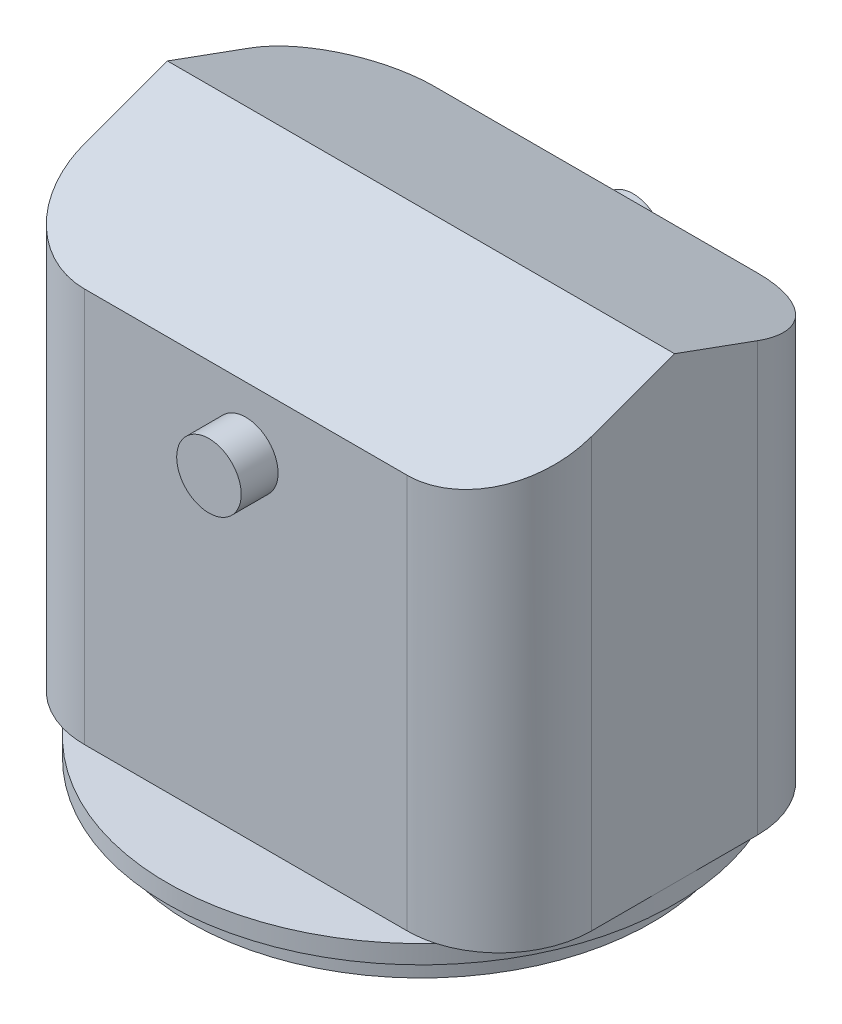
ISO-10303-21;
HEADER;
FILE_DESCRIPTION(('STEP AP214'),'2;1');
FILE_NAME('part.step','',(''),(''),'','','');
FILE_SCHEMA(('AUTOMOTIVE_DESIGN { 1 0 10303 214 1 1 1 1 }'));
ENDSEC;
DATA;
#1=APPLICATION_CONTEXT('core data for automotive mechanical design processes');
#2=APPLICATION_PROTOCOL_DEFINITION('international standard','automotive_design',2000,#1);
#3=PRODUCT_CONTEXT('',#1,'mechanical');
#4=PRODUCT('Part','Part','',(#3));
#5=PRODUCT_RELATED_PRODUCT_CATEGORY('part','',(#4));
#6=PRODUCT_DEFINITION_FORMATION('','',#4);
#7=PRODUCT_DEFINITION_CONTEXT('part definition',#1,'design');
#8=PRODUCT_DEFINITION('design','',#6,#7);
#9=PRODUCT_DEFINITION_SHAPE('','',#8);
#10=(LENGTH_UNIT() NAMED_UNIT(*) SI_UNIT(.MILLI.,.METRE.));
#11=(NAMED_UNIT(*) PLANE_ANGLE_UNIT() SI_UNIT($,.RADIAN.));
#12=(NAMED_UNIT(*) SI_UNIT($,.STERADIAN.) SOLID_ANGLE_UNIT());
#13=UNCERTAINTY_MEASURE_WITH_UNIT(LENGTH_MEASURE(1.E-05),#10,'distance_accuracy_value','');
#14=(GEOMETRIC_REPRESENTATION_CONTEXT(3) GLOBAL_UNCERTAINTY_ASSIGNED_CONTEXT((#13)) GLOBAL_UNIT_ASSIGNED_CONTEXT((#10,
#11,#12)) REPRESENTATION_CONTEXT('',''));
#15=CARTESIAN_POINT('',(0.,0.,0.));
#16=DIRECTION('',(0.,0.,1.));
#17=DIRECTION('',(1.,0.,0.));
#18=AXIS2_PLACEMENT_3D('',#15,#16,#17);
#19=CARTESIAN_POINT('',(0.,2.,0.));
#20=DIRECTION('',(0.,1.,0.));
#21=DIRECTION('',(0.,0.,1.));
#22=AXIS2_PLACEMENT_3D('',#19,#20,#21);
#23=PLANE('',#22);
#24=CARTESIAN_POINT('',(-17.5,2.,-9.));
#25=DIRECTION('',(0.,1.,0.));
#26=DIRECTION('',(0.,0.,-1.));
#27=AXIS2_PLACEMENT_3D('',#24,#25,#26);
#28=CIRCLE('',#27,10.);
#29=CARTESIAN_POINT('',(-17.4999999999999,2.,-19.));
#30=VERTEX_POINT('',#29);
#31=CARTESIAN_POINT('',(-20.2396202307024,2.,-18.6174051069676));
#32=VERTEX_POINT('',#31);
#33=EDGE_CURVE('E175',#30,#32,#28,.T.);
#34=ORIENTED_EDGE('',*,*,#33,.F.);
#35=DIRECTION('',(-1.,0.,0.));
#36=VECTOR('',#35,1.);
#37=CARTESIAN_POINT('',(-17.4999999999999,2.,-19.));
#38=LINE('',#37,#36);
#39=CARTESIAN_POINT('',(17.4999999999999,2.,-19.));
#40=VERTEX_POINT('',#39);
#41=EDGE_CURVE('E170',#40,#30,#38,.T.);
#42=ORIENTED_EDGE('',*,*,#41,.F.);
#43=CARTESIAN_POINT('',(17.5,2.,-9.));
#44=DIRECTION('',(0.,1.,0.));
#45=DIRECTION('',(0.,0.,-1.));
#46=AXIS2_PLACEMENT_3D('',#43,#44,#45);
#47=CIRCLE('',#46,10.);
#48=CARTESIAN_POINT('',(20.2396202307024,2.,-18.6174051069676));
#49=VERTEX_POINT('',#48);
#50=EDGE_CURVE('E171',#49,#40,#47,.T.);
#51=ORIENTED_EDGE('',*,*,#50,.F.);
#52=CARTESIAN_POINT('',(0.,2.,0.));
#53=DIRECTION('',(0.,1.,0.));
#54=DIRECTION('',(0.,0.,1.));
#55=AXIS2_PLACEMENT_3D('',#52,#53,#54);
#56=CIRCLE('',#55,27.5);
#57=EDGE_CURVE('E521',#49,#32,#56,.T.);
#58=ORIENTED_EDGE('',*,*,#57,.T.);
#59=EDGE_LOOP('',(#34,#42,#51,#58));
#60=FACE_BOUND('',#59,.T.);
#61=ADVANCED_FACE('F41',(#60),#23,.T.);
#62=CARTESIAN_POINT('',(0.,2.,0.));
#63=DIRECTION('',(0.,-1.,0.));
#64=DIRECTION('',(0.,0.,-1.));
#65=AXIS2_PLACEMENT_3D('',#62,#63,#64);
#66=CYLINDRICAL_SURFACE('',#65,27.5);
#67=CARTESIAN_POINT('',(20.2396202307024,2.,18.6174051069676));
#68=VERTEX_POINT('',#67);
#69=CARTESIAN_POINT('',(27.5,2.,0.));
#70=VERTEX_POINT('',#69);
#71=EDGE_CURVE('E204',#68,#70,#56,.T.);
#72=ORIENTED_EDGE('',*,*,#71,.F.);
#73=CARTESIAN_POINT('',(-20.2396202307024,2.,18.6174051069676));
#74=VERTEX_POINT('',#73);
#75=EDGE_CURVE('E150',#74,#68,#56,.T.);
#76=ORIENTED_EDGE('',*,*,#75,.F.);
#77=CARTESIAN_POINT('',(-27.5,2.,0.));
#78=VERTEX_POINT('',#77);
#79=EDGE_CURVE('E515',#78,#74,#56,.T.);
#80=ORIENTED_EDGE('',*,*,#79,.F.);
#81=EDGE_CURVE('E520',#32,#78,#56,.T.);
#82=ORIENTED_EDGE('',*,*,#81,.F.);
#83=ORIENTED_EDGE('',*,*,#57,.F.);
#84=EDGE_CURVE('E208',#70,#49,#56,.T.);
#85=ORIENTED_EDGE('',*,*,#84,.F.);
#86=EDGE_LOOP('',(#72,#76,#80,#82,#83,#85));
#87=FACE_BOUND('',#86,.T.);
#88=CARTESIAN_POINT('',(0.,0.,0.));
#89=DIRECTION('',(0.,1.,0.));
#90=DIRECTION('',(0.,0.,1.));
#91=AXIS2_PLACEMENT_3D('',#88,#89,#90);
#92=CIRCLE('',#91,27.5);
#93=CARTESIAN_POINT('',(0.,0.,27.5));
#94=VERTEX_POINT('',#93);
#95=EDGE_CURVE('E203',#94,#94,#92,.T.);
#96=ORIENTED_EDGE('',*,*,#95,.T.);
#97=EDGE_LOOP('',(#96));
#98=FACE_BOUND('',#97,.T.);
#99=ADVANCED_FACE('F250',(#87,#98),#66,.T.);
#100=CARTESIAN_POINT('',(-17.5,2.,9.));
#101=DIRECTION('',(0.,1.,0.));
#102=DIRECTION('',(0.,0.,-1.));
#103=AXIS2_PLACEMENT_3D('',#100,#101,#102);
#104=CIRCLE('',#103,10.);
#105=CARTESIAN_POINT('',(-17.4999999999999,2.,19.));
#106=VERTEX_POINT('',#105);
#107=EDGE_CURVE('E161',#74,#106,#104,.T.);
#108=ORIENTED_EDGE('',*,*,#107,.F.);
#109=ORIENTED_EDGE('',*,*,#75,.T.);
#110=CARTESIAN_POINT('',(17.5,2.,9.));
#111=DIRECTION('',(0.,1.,0.));
#112=DIRECTION('',(0.,0.,1.));
#113=AXIS2_PLACEMENT_3D('',#110,#111,#112);
#114=CIRCLE('',#113,10.);
#115=CARTESIAN_POINT('',(17.4999999999999,2.,19.));
#116=VERTEX_POINT('',#115);
#117=EDGE_CURVE('E136',#116,#68,#114,.T.);
#118=ORIENTED_EDGE('',*,*,#117,.F.);
#119=DIRECTION('',(1.,0.,0.));
#120=VECTOR('',#119,1.);
#121=CARTESIAN_POINT('',(-17.4999999999999,2.,19.));
#122=LINE('',#121,#120);
#123=EDGE_CURVE('E147',#106,#116,#122,.T.);
#124=ORIENTED_EDGE('',*,*,#123,.F.);
#125=EDGE_LOOP('',(#108,#109,#118,#124));
#126=FACE_BOUND('',#125,.T.);
#127=ADVANCED_FACE('F146',(#126),#23,.T.);
#128=CARTESIAN_POINT('',(0.,0.,0.));
#129=DIRECTION('',(0.,1.,0.));
#130=DIRECTION('',(0.,0.,1.));
#131=AXIS2_PLACEMENT_3D('',#128,#129,#130);
#132=PLANE('',#131);
#133=CARTESIAN_POINT('',(0.,0.,0.));
#134=DIRECTION('',(0.,1.,0.));
#135=DIRECTION('',(0.,0.,1.));
#136=AXIS2_PLACEMENT_3D('',#133,#134,#135);
#137=CIRCLE('',#136,25.);
#138=CARTESIAN_POINT('',(0.,0.,25.));
#139=VERTEX_POINT('',#138);
#140=EDGE_CURVE('E207',#139,#139,#137,.F.);
#141=ORIENTED_EDGE('',*,*,#140,.F.);
#142=EDGE_LOOP('',(#141));
#143=FACE_BOUND('',#142,.T.);
#144=ORIENTED_EDGE('',*,*,#95,.F.);
#145=EDGE_LOOP('',(#144));
#146=FACE_BOUND('',#145,.T.);
#147=ADVANCED_FACE('F262',(#143,#146),#132,.F.);
#148=CARTESIAN_POINT('',(0.,-3.,0.));
#149=DIRECTION('',(0.,-1.,0.));
#150=DIRECTION('',(0.,0.,-1.));
#151=AXIS2_PLACEMENT_3D('',#148,#149,#150);
#152=PLANE('',#151);
#153=CARTESIAN_POINT('',(0.,-3.,0.));
#154=DIRECTION('',(0.,-1.,0.));
#155=DIRECTION('',(0.,0.,-1.));
#156=AXIS2_PLACEMENT_3D('',#153,#154,#155);
#157=CIRCLE('',#156,25.);
#158=CARTESIAN_POINT('',(0.,-3.,-25.));
#159=VERTEX_POINT('',#158);
#160=EDGE_CURVE('E198',#159,#159,#157,.T.);
#161=ORIENTED_EDGE('',*,*,#160,.T.);
#162=EDGE_LOOP('',(#161));
#163=FACE_BOUND('',#162,.T.);
#164=CARTESIAN_POINT('',(0.,-3.,0.));
#165=DIRECTION('',(0.,-1.,0.));
#166=DIRECTION('',(0.,0.,-1.));
#167=AXIS2_PLACEMENT_3D('',#164,#165,#166);
#168=CIRCLE('',#167,23.);
#169=CARTESIAN_POINT('',(0.,-3.,-23.));
#170=VERTEX_POINT('',#169);
#171=EDGE_CURVE('E195',#170,#170,#168,.T.);
#172=ORIENTED_EDGE('',*,*,#171,.F.);
#173=EDGE_LOOP('',(#172));
#174=FACE_BOUND('',#173,.T.);
#175=ADVANCED_FACE('F266',(#163,#174),#152,.T.);
#176=CARTESIAN_POINT('',(0.,-3.,0.));
#177=DIRECTION('',(0.,1.,0.));
#178=DIRECTION('',(0.,0.,1.));
#179=AXIS2_PLACEMENT_3D('',#176,#177,#178);
#180=CYLINDRICAL_SURFACE('',#179,25.);
#181=ORIENTED_EDGE('',*,*,#160,.F.);
#182=EDGE_LOOP('',(#181));
#183=FACE_BOUND('',#182,.T.);
#184=ORIENTED_EDGE('',*,*,#140,.T.);
#185=EDGE_LOOP('',(#184));
#186=FACE_BOUND('',#185,.T.);
#187=ADVANCED_FACE('F272',(#183,#186),#180,.T.);
#188=CARTESIAN_POINT('',(0.,-3.,0.));
#189=DIRECTION('',(0.,1.,0.));
#190=DIRECTION('',(0.,0.,1.));
#191=AXIS2_PLACEMENT_3D('',#188,#189,#190);
#192=CYLINDRICAL_SURFACE('',#191,23.);
#193=ORIENTED_EDGE('',*,*,#171,.T.);
#194=EDGE_LOOP('',(#193));
#195=FACE_BOUND('',#194,.T.);
#196=CARTESIAN_POINT('',(0.,0.,0.));
#197=DIRECTION('',(0.,-1.,0.));
#198=DIRECTION('',(0.,0.,-1.));
#199=AXIS2_PLACEMENT_3D('',#196,#197,#198);
#200=CIRCLE('',#199,23.);
#201=CARTESIAN_POINT('',(0.,0.,-23.));
#202=VERTEX_POINT('',#201);
#203=EDGE_CURVE('E194',#202,#202,#200,.T.);
#204=ORIENTED_EDGE('',*,*,#203,.F.);
#205=EDGE_LOOP('',(#204));
#206=FACE_BOUND('',#205,.T.);
#207=ADVANCED_FACE('F279',(#195,#206),#192,.F.);
#208=ORIENTED_EDGE('',*,*,#203,.T.);
#209=EDGE_LOOP('',(#208));
#210=FACE_BOUND('',#209,.T.);
#211=ADVANCED_FACE('F268',(#210),#132,.F.);
#212=CARTESIAN_POINT('',(-17.5,2.,9.));
#213=DIRECTION('',(0.,-1.,0.));
#214=DIRECTION('',(0.,0.,-1.));
#215=AXIS2_PLACEMENT_3D('',#212,#213,#214);
#216=PLANE('',#215);
#217=CARTESIAN_POINT('',(27.5,2.,8.99999999999993));
#218=VERTEX_POINT('',#217);
#219=EDGE_CURVE('E153',#68,#218,#114,.T.);
#220=ORIENTED_EDGE('',*,*,#219,.F.);
#221=ORIENTED_EDGE('',*,*,#71,.T.);
#222=DIRECTION('',(0.,0.,-1.));
#223=VECTOR('',#222,1.);
#224=CARTESIAN_POINT('',(27.5,2.,8.99999999999993));
#225=LINE('',#224,#223);
#226=EDGE_CURVE('E164',#218,#70,#225,.T.);
#227=ORIENTED_EDGE('',*,*,#226,.F.);
#228=EDGE_LOOP('',(#220,#221,#227));
#229=FACE_BOUND('',#228,.T.);
#230=ADVANCED_FACE('F278',(#229),#216,.T.);
#231=CARTESIAN_POINT('',(27.5,2.,-8.99999999999993));
#232=VERTEX_POINT('',#231);
#233=EDGE_CURVE('E152',#70,#232,#225,.T.);
#234=ORIENTED_EDGE('',*,*,#233,.F.);
#235=ORIENTED_EDGE('',*,*,#84,.T.);
#236=EDGE_CURVE('E167',#232,#49,#47,.T.);
#237=ORIENTED_EDGE('',*,*,#236,.F.);
#238=EDGE_LOOP('',(#234,#235,#237));
#239=FACE_BOUND('',#238,.T.);
#240=ADVANCED_FACE('F285',(#239),#216,.T.);
#241=CARTESIAN_POINT('',(-27.5,2.,-8.99999999999993));
#242=VERTEX_POINT('',#241);
#243=EDGE_CURVE('E174',#32,#242,#28,.T.);
#244=ORIENTED_EDGE('',*,*,#243,.F.);
#245=ORIENTED_EDGE('',*,*,#81,.T.);
#246=DIRECTION('',(0.,0.,1.));
#247=VECTOR('',#246,1.);
#248=CARTESIAN_POINT('',(-27.5,2.,8.99999999999993));
#249=LINE('',#248,#247);
#250=EDGE_CURVE('E179',#242,#78,#249,.T.);
#251=ORIENTED_EDGE('',*,*,#250,.F.);
#252=EDGE_LOOP('',(#244,#245,#251));
#253=FACE_BOUND('',#252,.T.);
#254=ADVANCED_FACE('F247',(#253),#216,.T.);
#255=CARTESIAN_POINT('',(-17.5,52.8,9.));
#256=DIRECTION('',(0.,-1.,0.));
#257=DIRECTION('',(0.,0.,-1.));
#258=AXIS2_PLACEMENT_3D('',#255,#256,#257);
#259=CYLINDRICAL_SURFACE('',#258,10.);
#260=DIRECTION('',(0.,-1.,0.));
#261=VECTOR('',#260,1.);
#262=CARTESIAN_POINT('',(-17.4999999999999,52.8,19.));
#263=LINE('',#262,#261);
#264=CARTESIAN_POINT('',(-17.4999999999999,44.7999999999998,19.));
#265=VERTEX_POINT('',#264);
#266=EDGE_CURVE('E141',#265,#106,#263,.T.);
#267=ORIENTED_EDGE('',*,*,#266,.F.);
#268=CARTESIAN_POINT('',(-17.5,48.4397023426618,9.));
#269=DIRECTION('',(0.,-0.93969262078591,-0.342020143325665));
#270=DIRECTION('',(0.,-0.342020143325665,0.93969262078591));
#271=AXIS2_PLACEMENT_3D('',#268,#269,#270);
#272=ELLIPSE('',#271,10.6417777247591,10.);
#273=CARTESIAN_POINT('',(-27.5,48.4397023426619,8.99999999999993));
#274=VERTEX_POINT('',#273);
#275=EDGE_CURVE('E57',#265,#274,#272,.T.);
#276=ORIENTED_EDGE('',*,*,#275,.T.);
#277=DIRECTION('',(0.,-1.,0.));
#278=VECTOR('',#277,1.);
#279=CARTESIAN_POINT('',(-27.5,52.8,8.99999999999993));
#280=LINE('',#279,#278);
#281=CARTESIAN_POINT('',(-27.5,2.,8.99999999999993));
#282=VERTEX_POINT('',#281);
#283=EDGE_CURVE('E182',#274,#282,#280,.T.);
#284=ORIENTED_EDGE('',*,*,#283,.T.);
#285=EDGE_CURVE('E156',#282,#74,#104,.T.);
#286=ORIENTED_EDGE('',*,*,#285,.T.);
#287=ORIENTED_EDGE('',*,*,#107,.T.);
#288=EDGE_LOOP('',(#267,#276,#284,#286,#287));
#289=FACE_BOUND('',#288,.T.);
#290=ADVANCED_FACE('F239',(#289),#259,.T.);
#291=CARTESIAN_POINT('',(-17.4999999999999,52.8,19.));
#292=DIRECTION('',(0.,0.,-1.));
#293=DIRECTION('',(-1.,0.,0.));
#294=AXIS2_PLACEMENT_3D('',#291,#292,#293);
#295=PLANE('',#294);
#296=CARTESIAN_POINT('',(0.,38.,19.));
#297=DIRECTION('',(0.,0.,-1.));
#298=DIRECTION('',(-1.,0.,0.));
#299=AXIS2_PLACEMENT_3D('',#296,#297,#298);
#300=CIRCLE('',#299,3.5);
#301=CARTESIAN_POINT('',(-3.5,38.,19.));
#302=VERTEX_POINT('',#301);
#303=EDGE_CURVE('E50',#302,#302,#300,.F.);
#304=ORIENTED_EDGE('',*,*,#303,.F.);
#305=EDGE_LOOP('',(#304));
#306=FACE_BOUND('',#305,.T.);
#307=DIRECTION('',(0.,-1.,0.));
#308=VECTOR('',#307,1.);
#309=CARTESIAN_POINT('',(17.4999999999999,52.8,19.));
#310=LINE('',#309,#308);
#311=CARTESIAN_POINT('',(17.4999999999999,44.7999999999998,19.));
#312=VERTEX_POINT('',#311);
#313=EDGE_CURVE('E131',#312,#116,#310,.T.);
#314=ORIENTED_EDGE('',*,*,#313,.F.);
#315=DIRECTION('',(-1.,0.,0.));
#316=VECTOR('',#315,1.);
#317=CARTESIAN_POINT('',(-17.4999999999999,44.7999999999998,19.));
#318=LINE('',#317,#316);
#319=EDGE_CURVE('E229',#312,#265,#318,.T.);
#320=ORIENTED_EDGE('',*,*,#319,.T.);
#321=ORIENTED_EDGE('',*,*,#266,.T.);
#322=ORIENTED_EDGE('',*,*,#123,.T.);
#323=EDGE_LOOP('',(#314,#320,#321,#322));
#324=FACE_BOUND('',#323,.T.);
#325=ADVANCED_FACE('F155',(#306,#324),#295,.F.);
#326=CARTESIAN_POINT('',(17.5,52.8,9.));
#327=DIRECTION('',(0.,-1.,0.));
#328=DIRECTION('',(0.,0.,-1.));
#329=AXIS2_PLACEMENT_3D('',#326,#327,#328);
#330=CYLINDRICAL_SURFACE('',#329,10.);
#331=DIRECTION('',(0.,-1.,0.));
#332=VECTOR('',#331,1.);
#333=CARTESIAN_POINT('',(27.5,52.8,8.99999999999993));
#334=LINE('',#333,#332);
#335=CARTESIAN_POINT('',(27.5,48.4397023426619,8.99999999999993));
#336=VERTEX_POINT('',#335);
#337=EDGE_CURVE('E142',#336,#218,#334,.T.);
#338=ORIENTED_EDGE('',*,*,#337,.F.);
#339=CARTESIAN_POINT('',(17.5,48.4397023426618,9.));
#340=DIRECTION('',(0.,-0.93969262078591,-0.342020143325665));
#341=DIRECTION('',(0.,-0.342020143325665,0.93969262078591));
#342=AXIS2_PLACEMENT_3D('',#339,#340,#341);
#343=ELLIPSE('',#342,10.6417777247591,10.);
#344=EDGE_CURVE('E138',#336,#312,#343,.T.);
#345=ORIENTED_EDGE('',*,*,#344,.T.);
#346=ORIENTED_EDGE('',*,*,#313,.T.);
#347=ORIENTED_EDGE('',*,*,#117,.T.);
#348=ORIENTED_EDGE('',*,*,#219,.T.);
#349=EDGE_LOOP('',(#338,#345,#346,#347,#348));
#350=FACE_BOUND('',#349,.T.);
#351=ADVANCED_FACE('F134',(#350),#330,.T.);
#352=CARTESIAN_POINT('',(27.5,52.8,8.99999999999993));
#353=DIRECTION('',(-1.,0.,0.));
#354=DIRECTION('',(0.,0.,1.));
#355=AXIS2_PLACEMENT_3D('',#352,#353,#354);
#356=PLANE('',#355);
#357=DIRECTION('',(0.,-0.342020143325669,-0.939692620785908));
#358=VECTOR('',#357,1.);
#359=CARTESIAN_POINT('',(27.5,52.8,2.97981935563695));
#360=LINE('',#359,#358);
#361=CARTESIAN_POINT('',(27.5,48.4397023426621,-8.99999999999993));
#362=VERTEX_POINT('',#361);
#363=CARTESIAN_POINT('',(27.5,51.7154344510577,-3.38704758684472E-13));
#364=VERTEX_POINT('',#363);
#365=EDGE_CURVE('E221',#362,#364,#360,.F.);
#366=ORIENTED_EDGE('',*,*,#365,.T.);
#367=DIRECTION('',(0.,0.342020143325665,-0.93969262078591));
#368=VECTOR('',#367,1.);
#369=CARTESIAN_POINT('',(27.5,52.8,-2.97981935563767));
#370=LINE('',#369,#368);
#371=EDGE_CURVE('E226',#364,#336,#370,.F.);
#372=ORIENTED_EDGE('',*,*,#371,.T.);
#373=ORIENTED_EDGE('',*,*,#337,.T.);
#374=ORIENTED_EDGE('',*,*,#226,.T.);
#375=ORIENTED_EDGE('',*,*,#233,.T.);
#376=DIRECTION('',(0.,-1.,0.));
#377=VECTOR('',#376,1.);
#378=CARTESIAN_POINT('',(27.5,52.8,-8.99999999999993));
#379=LINE('',#378,#377);
#380=EDGE_CURVE('E190',#362,#232,#379,.T.);
#381=ORIENTED_EDGE('',*,*,#380,.F.);
#382=EDGE_LOOP('',(#366,#372,#373,#374,#375,#381));
#383=FACE_BOUND('',#382,.T.);
#384=ADVANCED_FACE('F245',(#383),#356,.F.);
#385=CARTESIAN_POINT('',(17.5,52.8,-9.));
#386=DIRECTION('',(0.,-1.,0.));
#387=DIRECTION('',(0.,0.,-1.));
#388=AXIS2_PLACEMENT_3D('',#385,#386,#387);
#389=CYLINDRICAL_SURFACE('',#388,10.);
#390=DIRECTION('',(0.,-1.,0.));
#391=VECTOR('',#390,1.);
#392=CARTESIAN_POINT('',(17.4999999999999,52.8,-19.));
#393=LINE('',#392,#391);
#394=CARTESIAN_POINT('',(17.4999999999999,44.8,-19.));
#395=VERTEX_POINT('',#394);
#396=EDGE_CURVE('E188',#395,#40,#393,.T.);
#397=ORIENTED_EDGE('',*,*,#396,.F.);
#398=CARTESIAN_POINT('',(17.5,48.439702342662,-9.));
#399=DIRECTION('',(0.,-0.939692620785908,0.342020143325669));
#400=DIRECTION('',(0.,-0.342020143325669,-0.939692620785908));
#401=AXIS2_PLACEMENT_3D('',#398,#399,#400);
#402=ELLIPSE('',#401,10.6417777247591,10.);
#403=EDGE_CURVE('E219',#395,#362,#402,.T.);
#404=ORIENTED_EDGE('',*,*,#403,.T.);
#405=ORIENTED_EDGE('',*,*,#380,.T.);
#406=ORIENTED_EDGE('',*,*,#236,.T.);
#407=ORIENTED_EDGE('',*,*,#50,.T.);
#408=EDGE_LOOP('',(#397,#404,#405,#406,#407));
#409=FACE_BOUND('',#408,.T.);
#410=ADVANCED_FACE('F373',(#409),#389,.T.);
#411=CARTESIAN_POINT('',(-17.4999999999999,52.8,-19.));
#412=DIRECTION('',(0.,0.,1.));
#413=DIRECTION('',(1.,0.,0.));
#414=AXIS2_PLACEMENT_3D('',#411,#412,#413);
#415=PLANE('',#414);
#416=CARTESIAN_POINT('',(0.,38.,-19.));
#417=DIRECTION('',(0.,0.,1.));
#418=DIRECTION('',(1.,0.,0.));
#419=AXIS2_PLACEMENT_3D('',#416,#417,#418);
#420=CIRCLE('',#419,3.5);
#421=CARTESIAN_POINT('',(3.5,38.,-19.));
#422=VERTEX_POINT('',#421);
#423=EDGE_CURVE('E11',#422,#422,#420,.F.);
#424=ORIENTED_EDGE('',*,*,#423,.F.);
#425=EDGE_LOOP('',(#424));
#426=FACE_BOUND('',#425,.T.);
#427=DIRECTION('',(0.,-1.,0.));
#428=VECTOR('',#427,1.);
#429=CARTESIAN_POINT('',(-17.4999999999999,52.8,-19.));
#430=LINE('',#429,#428);
#431=CARTESIAN_POINT('',(-17.4999999999999,44.8,-19.));
#432=VERTEX_POINT('',#431);
#433=EDGE_CURVE('E186',#432,#30,#430,.T.);
#434=ORIENTED_EDGE('',*,*,#433,.F.);
#435=DIRECTION('',(1.,0.,0.));
#436=VECTOR('',#435,1.);
#437=CARTESIAN_POINT('',(-17.4999999999999,44.8,-19.));
#438=LINE('',#437,#436);
#439=EDGE_CURVE('E217',#432,#395,#438,.T.);
#440=ORIENTED_EDGE('',*,*,#439,.T.);
#441=ORIENTED_EDGE('',*,*,#396,.T.);
#442=ORIENTED_EDGE('',*,*,#41,.T.);
#443=EDGE_LOOP('',(#434,#440,#441,#442));
#444=FACE_BOUND('',#443,.T.);
#445=ADVANCED_FACE('F378',(#426,#444),#415,.F.);
#446=CARTESIAN_POINT('',(-17.5,52.8,-9.));
#447=DIRECTION('',(0.,-1.,0.));
#448=DIRECTION('',(0.,0.,-1.));
#449=AXIS2_PLACEMENT_3D('',#446,#447,#448);
#450=CYLINDRICAL_SURFACE('',#449,10.);
#451=DIRECTION('',(0.,-1.,0.));
#452=VECTOR('',#451,1.);
#453=CARTESIAN_POINT('',(-27.5,52.8,-8.99999999999993));
#454=LINE('',#453,#452);
#455=CARTESIAN_POINT('',(-27.5,48.4397023426621,-8.99999999999993));
#456=VERTEX_POINT('',#455);
#457=EDGE_CURVE('E184',#456,#242,#454,.T.);
#458=ORIENTED_EDGE('',*,*,#457,.F.);
#459=CARTESIAN_POINT('',(-17.5,48.439702342662,-9.));
#460=DIRECTION('',(0.,-0.939692620785908,0.342020143325669));
#461=DIRECTION('',(0.,-0.342020143325669,-0.939692620785908));
#462=AXIS2_PLACEMENT_3D('',#459,#460,#461);
#463=ELLIPSE('',#462,10.6417777247591,10.);
#464=EDGE_CURVE('E215',#456,#432,#463,.T.);
#465=ORIENTED_EDGE('',*,*,#464,.T.);
#466=ORIENTED_EDGE('',*,*,#433,.T.);
#467=ORIENTED_EDGE('',*,*,#33,.T.);
#468=ORIENTED_EDGE('',*,*,#243,.T.);
#469=EDGE_LOOP('',(#458,#465,#466,#467,#468));
#470=FACE_BOUND('',#469,.T.);
#471=ADVANCED_FACE('F388',(#470),#450,.T.);
#472=CARTESIAN_POINT('',(-27.5,52.8,8.99999999999993));
#473=DIRECTION('',(1.,0.,0.));
#474=DIRECTION('',(0.,0.,-1.));
#475=AXIS2_PLACEMENT_3D('',#472,#473,#474);
#476=PLANE('',#475);
#477=ORIENTED_EDGE('',*,*,#283,.F.);
#478=DIRECTION('',(0.,-0.342020143325665,0.93969262078591));
#479=VECTOR('',#478,1.);
#480=CARTESIAN_POINT('',(-27.5,52.8,-2.97981935563767));
#481=LINE('',#480,#479);
#482=CARTESIAN_POINT('',(-27.5,51.7154344510577,-3.38704758684472E-13));
#483=VERTEX_POINT('',#482);
#484=EDGE_CURVE('E232',#274,#483,#481,.F.);
#485=ORIENTED_EDGE('',*,*,#484,.T.);
#486=DIRECTION('',(0.,0.342020143325669,0.939692620785908));
#487=VECTOR('',#486,1.);
#488=CARTESIAN_POINT('',(-27.5,52.8,2.97981935563695));
#489=LINE('',#488,#487);
#490=EDGE_CURVE('E213',#483,#456,#489,.F.);
#491=ORIENTED_EDGE('',*,*,#490,.T.);
#492=ORIENTED_EDGE('',*,*,#457,.T.);
#493=ORIENTED_EDGE('',*,*,#250,.T.);
#494=EDGE_CURVE('E178',#78,#282,#249,.T.);
#495=ORIENTED_EDGE('',*,*,#494,.T.);
#496=EDGE_LOOP('',(#477,#485,#491,#492,#493,#495));
#497=FACE_BOUND('',#496,.T.);
#498=ADVANCED_FACE('F364',(#497),#476,.F.);
#499=ORIENTED_EDGE('',*,*,#494,.F.);
#500=ORIENTED_EDGE('',*,*,#79,.T.);
#501=ORIENTED_EDGE('',*,*,#285,.F.);
#502=EDGE_LOOP('',(#499,#500,#501));
#503=FACE_BOUND('',#502,.T.);
#504=ADVANCED_FACE('F288',(#503),#216,.T.);
#505=CARTESIAN_POINT('',(-17.5,52.8,2.97981935563695));
#506=DIRECTION('',(0.,-0.939692620785908,0.342020143325669));
#507=DIRECTION('',(-1.,0.,0.));
#508=AXIS2_PLACEMENT_3D('',#505,#506,#507);
#509=PLANE('',#508);
#510=ORIENTED_EDGE('',*,*,#490,.F.);
#511=DIRECTION('',(1.,0.,0.));
#512=VECTOR('',#511,1.);
#513=CARTESIAN_POINT('',(-17.5,51.7154344510577,-3.37403716077489E-13));
#514=LINE('',#513,#512);
#515=EDGE_CURVE('E224',#483,#364,#514,.T.);
#516=ORIENTED_EDGE('',*,*,#515,.T.);
#517=ORIENTED_EDGE('',*,*,#365,.F.);
#518=ORIENTED_EDGE('',*,*,#403,.F.);
#519=ORIENTED_EDGE('',*,*,#439,.F.);
#520=ORIENTED_EDGE('',*,*,#464,.F.);
#521=EDGE_LOOP('',(#510,#516,#517,#518,#519,#520));
#522=FACE_BOUND('',#521,.T.);
#523=ADVANCED_FACE('F363',(#522),#509,.F.);
#524=CARTESIAN_POINT('',(-17.5,52.8,-2.97981935563767));
#525=DIRECTION('',(0.,-0.93969262078591,-0.342020143325665));
#526=DIRECTION('',(1.,0.,0.));
#527=AXIS2_PLACEMENT_3D('',#524,#525,#526);
#528=PLANE('',#527);
#529=ORIENTED_EDGE('',*,*,#275,.F.);
#530=ORIENTED_EDGE('',*,*,#319,.F.);
#531=ORIENTED_EDGE('',*,*,#344,.F.);
#532=ORIENTED_EDGE('',*,*,#371,.F.);
#533=ORIENTED_EDGE('',*,*,#515,.F.);
#534=ORIENTED_EDGE('',*,*,#484,.F.);
#535=EDGE_LOOP('',(#529,#530,#531,#532,#533,#534));
#536=FACE_BOUND('',#535,.T.);
#537=ADVANCED_FACE('F44',(#536),#528,.F.);
#538=CARTESIAN_POINT('',(0.,38.,23.));
#539=DIRECTION('',(0.,0.,-1.));
#540=DIRECTION('',(-1.,0.,0.));
#541=AXIS2_PLACEMENT_3D('',#538,#539,#540);
#542=CYLINDRICAL_SURFACE('',#541,3.5);
#543=CARTESIAN_POINT('',(0.,38.,23.));
#544=DIRECTION('',(0.,0.,1.));
#545=DIRECTION('',(1.,0.,0.));
#546=AXIS2_PLACEMENT_3D('',#543,#544,#545);
#547=CIRCLE('',#546,3.5);
#548=CARTESIAN_POINT('',(3.5,38.,23.));
#549=VERTEX_POINT('',#548);
#550=EDGE_CURVE('E159',#549,#549,#547,.T.);
#551=ORIENTED_EDGE('',*,*,#550,.F.);
#552=EDGE_LOOP('',(#551));
#553=FACE_BOUND('',#552,.T.);
#554=ORIENTED_EDGE('',*,*,#303,.T.);
#555=EDGE_LOOP('',(#554));
#556=FACE_BOUND('',#555,.T.);
#557=ADVANCED_FACE('F236',(#553,#556),#542,.T.);
#558=CARTESIAN_POINT('',(0.,38.,23.));
#559=DIRECTION('',(0.,0.,1.));
#560=DIRECTION('',(1.,0.,0.));
#561=AXIS2_PLACEMENT_3D('',#558,#559,#560);
#562=PLANE('',#561);
#563=ORIENTED_EDGE('',*,*,#550,.T.);
#564=EDGE_LOOP('',(#563));
#565=FACE_BOUND('',#564,.T.);
#566=ADVANCED_FACE('F444',(#565),#562,.T.);
#567=CARTESIAN_POINT('',(0.,38.,-23.));
#568=DIRECTION('',(0.,0.,1.));
#569=DIRECTION('',(1.,0.,0.));
#570=AXIS2_PLACEMENT_3D('',#567,#568,#569);
#571=CYLINDRICAL_SURFACE('',#570,3.5);
#572=CARTESIAN_POINT('',(0.,38.,-23.));
#573=DIRECTION('',(0.,0.,-1.));
#574=DIRECTION('',(-1.,0.,0.));
#575=AXIS2_PLACEMENT_3D('',#572,#573,#574);
#576=CIRCLE('',#575,3.5);
#577=CARTESIAN_POINT('',(-3.5,38.,-23.));
#578=VERTEX_POINT('',#577);
#579=EDGE_CURVE('E487',#578,#578,#576,.T.);
#580=ORIENTED_EDGE('',*,*,#579,.F.);
#581=EDGE_LOOP('',(#580));
#582=FACE_BOUND('',#581,.T.);
#583=ORIENTED_EDGE('',*,*,#423,.T.);
#584=EDGE_LOOP('',(#583));
#585=FACE_BOUND('',#584,.T.);
#586=ADVANCED_FACE('F454',(#582,#585),#571,.T.);
#587=CARTESIAN_POINT('',(0.,38.,-23.));
#588=DIRECTION('',(0.,0.,-1.));
#589=DIRECTION('',(-1.,0.,0.));
#590=AXIS2_PLACEMENT_3D('',#587,#588,#589);
#591=PLANE('',#590);
#592=ORIENTED_EDGE('',*,*,#579,.T.);
#593=EDGE_LOOP('',(#592));
#594=FACE_BOUND('',#593,.T.);
#595=ADVANCED_FACE('F471',(#594),#591,.T.);
#596=CLOSED_SHELL('',(#61,#99,#127,#147,#175,#187,#207,#211,#230,#240,#254,#290,#325,#351,#384,
#410,#445,#471,#498,#504,#523,#537,#557,#566,#586,#595));
#597=MANIFOLD_SOLID_BREP('B2',#596);
#598=ADVANCED_BREP_SHAPE_REPRESENTATION('',(#18,#597),#14);
#599=SHAPE_DEFINITION_REPRESENTATION(#9,#598);
ENDSEC;
END-ISO-10303-21;
